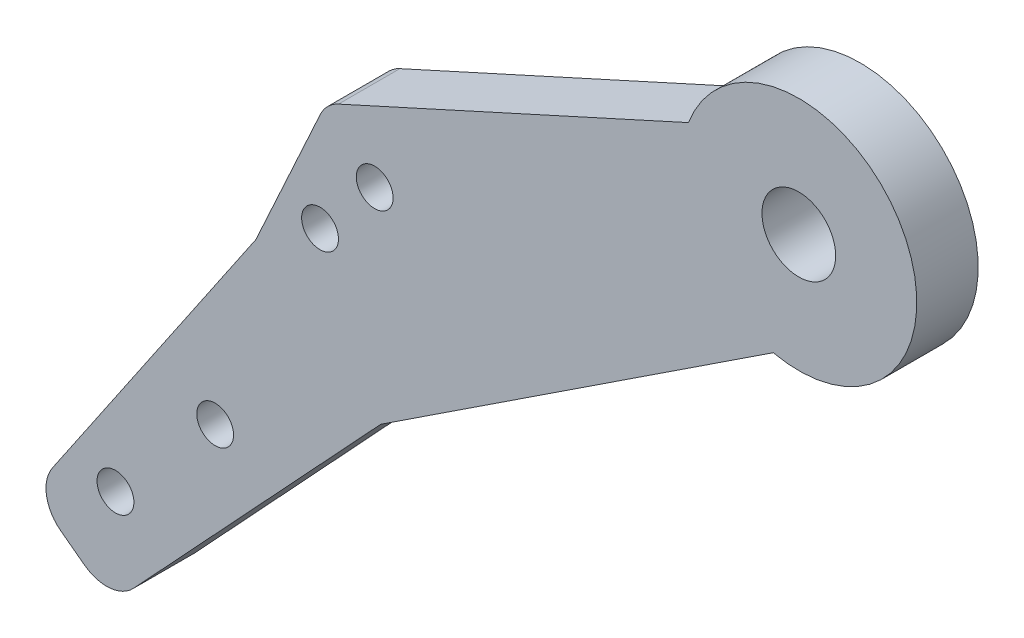
ISO-10303-21;
HEADER;
FILE_DESCRIPTION(('STEP AP214'),'2;1');
FILE_NAME('part.step','',(''),(''),'','','');
FILE_SCHEMA(('AUTOMOTIVE_DESIGN { 1 0 10303 214 1 1 1 1 }'));
ENDSEC;
DATA;
#1=APPLICATION_CONTEXT('core data for automotive mechanical design processes');
#2=APPLICATION_PROTOCOL_DEFINITION('international standard','automotive_design',2000,#1);
#3=PRODUCT_CONTEXT('',#1,'mechanical');
#4=PRODUCT('Part','Part','',(#3));
#5=PRODUCT_RELATED_PRODUCT_CATEGORY('part','',(#4));
#6=PRODUCT_DEFINITION_FORMATION('','',#4);
#7=PRODUCT_DEFINITION_CONTEXT('part definition',#1,'design');
#8=PRODUCT_DEFINITION('design','',#6,#7);
#9=PRODUCT_DEFINITION_SHAPE('','',#8);
#10=(LENGTH_UNIT() NAMED_UNIT(*) SI_UNIT(.MILLI.,.METRE.));
#11=(NAMED_UNIT(*) PLANE_ANGLE_UNIT() SI_UNIT($,.RADIAN.));
#12=(NAMED_UNIT(*) SI_UNIT($,.STERADIAN.) SOLID_ANGLE_UNIT());
#13=UNCERTAINTY_MEASURE_WITH_UNIT(LENGTH_MEASURE(1.E-05),#10,'distance_accuracy_value','');
#14=(GEOMETRIC_REPRESENTATION_CONTEXT(3) GLOBAL_UNCERTAINTY_ASSIGNED_CONTEXT((#13)) GLOBAL_UNIT_ASSIGNED_CONTEXT((#10,
#11,#12)) REPRESENTATION_CONTEXT('',''));
#15=CARTESIAN_POINT('',(0.,0.,0.));
#16=DIRECTION('',(0.,0.,1.));
#17=DIRECTION('',(1.,0.,0.));
#18=AXIS2_PLACEMENT_3D('',#15,#16,#17);
#19=CARTESIAN_POINT('',(-36.234007884933,-12.2764814733259,5.));
#20=DIRECTION('',(0.,0.,1.));
#21=DIRECTION('',(1.,0.,0.));
#22=AXIS2_PLACEMENT_3D('',#19,#20,#21);
#23=CYLINDRICAL_SURFACE('',#22,3.);
#24=DIRECTION('',(0.,0.,1.));
#25=VECTOR('',#24,1.);
#26=CARTESIAN_POINT('',(-37.4746403881604,-9.54502929693041,5.));
#27=LINE('',#26,#25);
#28=CARTESIAN_POINT('',(-37.4746403881604,-9.54502929693041,0.));
#29=VERTEX_POINT('',#28);
#30=CARTESIAN_POINT('',(-37.4746403881604,-9.54502929693041,5.));
#31=VERTEX_POINT('',#30);
#32=EDGE_CURVE('E241',#29,#31,#27,.T.);
#33=ORIENTED_EDGE('',*,*,#32,.F.);
#34=CARTESIAN_POINT('',(-36.234007884933,-12.2764814733259,0.));
#35=DIRECTION('',(0.,0.,1.));
#36=DIRECTION('',(1.,0.,0.));
#37=AXIS2_PLACEMENT_3D('',#34,#35,#36);
#38=CIRCLE('',#37,3.);
#39=CARTESIAN_POINT('',(-38.9614603684219,-11.0270804367048,0.));
#40=VERTEX_POINT('',#39);
#41=EDGE_CURVE('E47',#40,#29,#38,.F.);
#42=ORIENTED_EDGE('',*,*,#41,.F.);
#43=DIRECTION('',(0.,0.,1.));
#44=VECTOR('',#43,1.);
#45=CARTESIAN_POINT('',(-38.9614603684219,-11.0270804367048,5.));
#46=LINE('',#45,#44);
#47=CARTESIAN_POINT('',(-38.9614603684219,-11.0270804367048,5.));
#48=VERTEX_POINT('',#47);
#49=EDGE_CURVE('E245',#48,#40,#46,.F.);
#50=ORIENTED_EDGE('',*,*,#49,.F.);
#51=CARTESIAN_POINT('',(-36.234007884933,-12.2764814733259,5.));
#52=DIRECTION('',(0.,0.,1.));
#53=DIRECTION('',(1.,0.,0.));
#54=AXIS2_PLACEMENT_3D('',#51,#52,#53);
#55=CIRCLE('',#54,3.);
#56=EDGE_CURVE('E11',#31,#48,#55,.T.);
#57=ORIENTED_EDGE('',*,*,#56,.F.);
#58=EDGE_LOOP('',(#33,#42,#50,#57));
#59=FACE_BOUND('',#58,.T.);
#60=ADVANCED_FACE('F39',(#59),#23,.T.);
#61=CARTESIAN_POINT('',(-58.2845231728592,-48.5302631190641,5.));
#62=DIRECTION('',(0.,0.,1.));
#63=DIRECTION('',(1.,0.,0.));
#64=AXIS2_PLACEMENT_3D('',#61,#62,#63);
#65=CYLINDRICAL_SURFACE('',#64,3.);
#66=DIRECTION('',(0.,0.,1.));
#67=VECTOR('',#66,1.);
#68=CARTESIAN_POINT('',(-60.7660495364761,-46.8444318977746,5.));
#69=LINE('',#68,#67);
#70=CARTESIAN_POINT('',(-60.7660495364761,-46.8444318977746,0.));
#71=VERTEX_POINT('',#70);
#72=CARTESIAN_POINT('',(-60.7660495364761,-46.8444318977746,5.));
#73=VERTEX_POINT('',#72);
#74=EDGE_CURVE('E227',#71,#73,#69,.T.);
#75=ORIENTED_EDGE('',*,*,#74,.F.);
#76=CARTESIAN_POINT('',(-58.2845231728592,-48.5302631190641,0.));
#77=DIRECTION('',(0.,0.,1.));
#78=DIRECTION('',(1.,0.,0.));
#79=AXIS2_PLACEMENT_3D('',#76,#77,#78);
#80=CIRCLE('',#79,3.);
#81=CARTESIAN_POINT('',(-60.0852189994931,-50.9297410914454,0.));
#82=VERTEX_POINT('',#81);
#83=EDGE_CURVE('E235',#82,#71,#80,.F.);
#84=ORIENTED_EDGE('',*,*,#83,.F.);
#85=DIRECTION('',(0.,0.,1.));
#86=VECTOR('',#85,1.);
#87=CARTESIAN_POINT('',(-60.0852189994931,-50.9297410914454,5.));
#88=LINE('',#87,#86);
#89=CARTESIAN_POINT('',(-60.0852189994931,-50.9297410914454,5.));
#90=VERTEX_POINT('',#89);
#91=EDGE_CURVE('E231',#90,#82,#88,.F.);
#92=ORIENTED_EDGE('',*,*,#91,.F.);
#93=CARTESIAN_POINT('',(-58.2845231728592,-48.5302631190641,5.));
#94=DIRECTION('',(0.,0.,1.));
#95=DIRECTION('',(1.,0.,0.));
#96=AXIS2_PLACEMENT_3D('',#93,#94,#95);
#97=CIRCLE('',#96,3.);
#98=EDGE_CURVE('E238',#73,#90,#97,.T.);
#99=ORIENTED_EDGE('',*,*,#98,.F.);
#100=EDGE_LOOP('',(#75,#84,#92,#99));
#101=FACE_BOUND('',#100,.T.);
#102=ADVANCED_FACE('F268',(#101),#65,.T.);
#103=CARTESIAN_POINT('',(-56.3531813204129,-49.9796447152002,5.));
#104=DIRECTION('',(0.,0.,-1.));
#105=DIRECTION('',(-1.,0.,0.));
#106=AXIS2_PLACEMENT_3D('',#103,#104,#105);
#107=CYLINDRICAL_SURFACE('',#106,3.);
#108=DIRECTION('',(0.,0.,-1.));
#109=VECTOR('',#108,1.);
#110=CARTESIAN_POINT('',(-54.1569788579378,-52.0233410585492,5.));
#111=LINE('',#110,#109);
#112=CARTESIAN_POINT('',(-54.1569788579378,-52.0233410585492,5.));
#113=VERTEX_POINT('',#112);
#114=CARTESIAN_POINT('',(-54.1569788579378,-52.0233410585492,0.));
#115=VERTEX_POINT('',#114);
#116=EDGE_CURVE('E126',#113,#115,#111,.T.);
#117=ORIENTED_EDGE('',*,*,#116,.F.);
#118=CARTESIAN_POINT('',(-56.3531813204129,-49.9796447152002,5.));
#119=DIRECTION('',(0.,0.,1.));
#120=DIRECTION('',(1.,0.,0.));
#121=AXIS2_PLACEMENT_3D('',#118,#119,#120);
#122=CIRCLE('',#121,3.);
#123=CARTESIAN_POINT('',(-58.1538771470468,-52.3791226875815,5.));
#124=VERTEX_POINT('',#123);
#125=EDGE_CURVE('E222',#124,#113,#122,.T.);
#126=ORIENTED_EDGE('',*,*,#125,.F.);
#127=DIRECTION('',(0.,0.,-1.));
#128=VECTOR('',#127,1.);
#129=CARTESIAN_POINT('',(-58.1538771470468,-52.3791226875815,5.));
#130=LINE('',#129,#128);
#131=CARTESIAN_POINT('',(-58.1538771470468,-52.3791226875815,0.));
#132=VERTEX_POINT('',#131);
#133=EDGE_CURVE('E218',#132,#124,#130,.F.);
#134=ORIENTED_EDGE('',*,*,#133,.F.);
#135=CARTESIAN_POINT('',(-56.3531813204129,-49.9796447152002,0.));
#136=DIRECTION('',(0.,0.,1.));
#137=DIRECTION('',(1.,0.,0.));
#138=AXIS2_PLACEMENT_3D('',#135,#136,#137);
#139=CIRCLE('',#138,3.);
#140=EDGE_CURVE('E225',#115,#132,#139,.F.);
#141=ORIENTED_EDGE('',*,*,#140,.F.);
#142=EDGE_LOOP('',(#117,#126,#134,#141));
#143=FACE_BOUND('',#142,.T.);
#144=ADVANCED_FACE('F259',(#143),#107,.T.);
#145=CARTESIAN_POINT('',(3.67686539619426,-5.58898567347146,5.));
#146=DIRECTION('',(0.549606187771937,-0.835423867484523,0.));
#147=DIRECTION('',(0.835423867484523,0.549606187771937,0.));
#148=AXIS2_PLACEMENT_3D('',#145,#146,#147);
#149=PLANE('',#148);
#150=DIRECTION('',(-0.835423867484523,-0.549606187771937,0.));
#151=VECTOR('',#150,1.);
#152=CARTESIAN_POINT('',(3.67686539619426,-5.58898567347146,0.));
#153=LINE('',#152,#151);
#154=CARTESIAN_POINT('',(-2.08089171723586,-9.37688192637293,0.));
#155=VERTEX_POINT('',#154);
#156=CARTESIAN_POINT('',(-34.0324813155954,-30.3970993703439,0.));
#157=VERTEX_POINT('',#156);
#158=EDGE_CURVE('E121',#155,#157,#153,.T.);
#159=ORIENTED_EDGE('',*,*,#158,.F.);
#160=DIRECTION('',(0.,0.,-1.));
#161=VECTOR('',#160,1.);
#162=CARTESIAN_POINT('',(-2.08089171723586,-9.37688192637293,5.));
#163=LINE('',#162,#161);
#164=CARTESIAN_POINT('',(-2.08089171723586,-9.37688192637293,5.));
#165=VERTEX_POINT('',#164);
#166=EDGE_CURVE('E114',#165,#155,#163,.T.);
#167=ORIENTED_EDGE('',*,*,#166,.F.);
#168=DIRECTION('',(-0.835423867484523,-0.549606187771937,0.));
#169=VECTOR('',#168,1.);
#170=CARTESIAN_POINT('',(3.67686539619426,-5.58898567347146,5.));
#171=LINE('',#170,#169);
#172=CARTESIAN_POINT('',(-34.0324813155954,-30.3970993703439,5.));
#173=VERTEX_POINT('',#172);
#174=EDGE_CURVE('E118',#165,#173,#171,.T.);
#175=ORIENTED_EDGE('',*,*,#174,.T.);
#176=DIRECTION('',(0.,0.,-1.));
#177=VECTOR('',#176,1.);
#178=CARTESIAN_POINT('',(-34.0324813155954,-30.3970993703439,5.));
#179=LINE('',#178,#177);
#180=EDGE_CURVE('E166',#173,#157,#179,.T.);
#181=ORIENTED_EDGE('',*,*,#180,.T.);
#182=EDGE_LOOP('',(#159,#167,#175,#181));
#183=FACE_BOUND('',#182,.T.);
#184=ADVANCED_FACE('F116',(#183),#149,.T.);
#185=CARTESIAN_POINT('',(0.,0.,5.));
#186=DIRECTION('',(0.,0.,-1.));
#187=DIRECTION('',(-1.,0.,0.));
#188=AXIS2_PLACEMENT_3D('',#185,#186,#187);
#189=CYLINDRICAL_SURFACE('',#188,9.605);
#190=CARTESIAN_POINT('',(0.,0.,0.));
#191=DIRECTION('',(0.,0.,1.));
#192=DIRECTION('',(1.,0.,0.));
#193=AXIS2_PLACEMENT_3D('',#190,#191,#192);
#194=CIRCLE('',#193,9.605);
#195=CARTESIAN_POINT('',(-8.98496773711044,3.39505224747493,0.));
#196=VERTEX_POINT('',#195);
#197=EDGE_CURVE('E185',#155,#196,#194,.T.);
#198=ORIENTED_EDGE('',*,*,#197,.T.);
#199=DIRECTION('',(0.,0.,-1.));
#200=VECTOR('',#199,1.);
#201=CARTESIAN_POINT('',(-8.98496773711044,3.39505224747493,5.));
#202=LINE('',#201,#200);
#203=CARTESIAN_POINT('',(-8.98496773711044,3.39505224747493,5.));
#204=VERTEX_POINT('',#203);
#205=EDGE_CURVE('E127',#204,#196,#202,.T.);
#206=ORIENTED_EDGE('',*,*,#205,.F.);
#207=CARTESIAN_POINT('',(0.,0.,5.));
#208=DIRECTION('',(0.,0.,1.));
#209=DIRECTION('',(1.,0.,0.));
#210=AXIS2_PLACEMENT_3D('',#207,#208,#209);
#211=CIRCLE('',#210,9.605);
#212=EDGE_CURVE('E131',#165,#204,#211,.T.);
#213=ORIENTED_EDGE('',*,*,#212,.F.);
#214=ORIENTED_EDGE('',*,*,#166,.T.);
#215=EDGE_LOOP('',(#198,#206,#213,#214));
#216=FACE_BOUND('',#215,.T.);
#217=ADVANCED_FACE('F132',(#216),#189,.T.);
#218=CARTESIAN_POINT('',(-2.81492152041373,6.19750288124389,5.));
#219=DIRECTION('',(-0.413544167742466,0.910484058798501,0.));
#220=DIRECTION('',(-0.910484058798501,-0.413544167742466,0.));
#221=AXIS2_PLACEMENT_3D('',#218,#219,#220);
#222=PLANE('',#221);
#223=DIRECTION('',(0.910484058798501,0.413544167742466,0.));
#224=VECTOR('',#223,1.);
#225=CARTESIAN_POINT('',(-2.81492152041373,6.19750288124389,0.));
#226=LINE('',#225,#224);
#227=EDGE_CURVE('E188',#29,#196,#226,.T.);
#228=ORIENTED_EDGE('',*,*,#227,.F.);
#229=ORIENTED_EDGE('',*,*,#32,.T.);
#230=DIRECTION('',(0.910484058798501,0.413544167742466,0.));
#231=VECTOR('',#230,1.);
#232=CARTESIAN_POINT('',(-2.81492152041373,6.19750288124389,5.));
#233=LINE('',#232,#231);
#234=EDGE_CURVE('E135',#31,#204,#233,.T.);
#235=ORIENTED_EDGE('',*,*,#234,.T.);
#236=ORIENTED_EDGE('',*,*,#205,.T.);
#237=EDGE_LOOP('',(#228,#229,#235,#236));
#238=FACE_BOUND('',#237,.T.);
#239=ADVANCED_FACE('F253',(#238),#222,.T.);
#240=CARTESIAN_POINT('',(-28.0286006282676,12.8394400606389,5.));
#241=DIRECTION('',(-0.909150827829651,0.416467012207042,0.));
#242=DIRECTION('',(-0.416467012207042,-0.909150827829651,0.));
#243=AXIS2_PLACEMENT_3D('',#240,#241,#242);
#244=PLANE('',#243);
#245=DIRECTION('',(0.416467012207042,0.909150827829651,0.));
#246=VECTOR('',#245,1.);
#247=CARTESIAN_POINT('',(-28.0286006282676,12.8394400606389,5.));
#248=LINE('',#247,#246);
#249=CARTESIAN_POINT('',(-44.1951076829761,-22.4521744996888,5.));
#250=VERTEX_POINT('',#249);
#251=EDGE_CURVE('E153',#250,#48,#248,.T.);
#252=ORIENTED_EDGE('',*,*,#251,.T.);
#253=ORIENTED_EDGE('',*,*,#49,.T.);
#254=DIRECTION('',(0.416467012207042,0.909150827829651,0.));
#255=VECTOR('',#254,1.);
#256=CARTESIAN_POINT('',(-28.0286006282676,12.8394400606389,0.));
#257=LINE('',#256,#255);
#258=CARTESIAN_POINT('',(-44.1951076829761,-22.4521744996888,0.));
#259=VERTEX_POINT('',#258);
#260=EDGE_CURVE('E191',#259,#40,#257,.T.);
#261=ORIENTED_EDGE('',*,*,#260,.F.);
#262=DIRECTION('',(0.,0.,-1.));
#263=VECTOR('',#262,1.);
#264=CARTESIAN_POINT('',(-44.1951076829761,-22.4521744996888,5.));
#265=LINE('',#264,#263);
#266=EDGE_CURVE('E209',#250,#259,#265,.T.);
#267=ORIENTED_EDGE('',*,*,#266,.F.);
#268=EDGE_LOOP('',(#252,#253,#261,#267));
#269=FACE_BOUND('',#268,.T.);
#270=ADVANCED_FACE('F275',(#269),#244,.T.);
#271=CARTESIAN_POINT('',(-19.8027866518628,13.4530732760731,5.));
#272=DIRECTION('',(-0.827175454538959,0.561943740429828,0.));
#273=DIRECTION('',(-0.561943740429828,-0.827175454538959,0.));
#274=AXIS2_PLACEMENT_3D('',#271,#272,#273);
#275=PLANE('',#274);
#276=DIRECTION('',(0.561943740429828,0.827175454538959,0.));
#277=VECTOR('',#276,1.);
#278=CARTESIAN_POINT('',(-19.8027866518628,13.4530732760731,0.));
#279=LINE('',#278,#277);
#280=EDGE_CURVE('E195',#71,#259,#279,.T.);
#281=ORIENTED_EDGE('',*,*,#280,.F.);
#282=ORIENTED_EDGE('',*,*,#74,.T.);
#283=DIRECTION('',(0.561943740429828,0.827175454538959,0.));
#284=VECTOR('',#283,1.);
#285=CARTESIAN_POINT('',(-19.8027866518628,13.4530732760731,5.));
#286=LINE('',#285,#284);
#287=EDGE_CURVE('E157',#73,#250,#286,.T.);
#288=ORIENTED_EDGE('',*,*,#287,.T.);
#289=ORIENTED_EDGE('',*,*,#266,.T.);
#290=EDGE_LOOP('',(#281,#282,#288,#289));
#291=FACE_BOUND('',#290,.T.);
#292=ADVANCED_FACE('F272',(#291),#275,.T.);
#293=CARTESIAN_POINT('',(-46.0978121579961,-61.4266347553275,5.));
#294=DIRECTION('',(-0.600231942211304,-0.799825990793777,0.));
#295=DIRECTION('',(0.799825990793777,-0.600231942211304,0.));
#296=AXIS2_PLACEMENT_3D('',#293,#294,#295);
#297=PLANE('',#296);
#298=DIRECTION('',(-0.799825990793776,0.600231942211304,0.));
#299=VECTOR('',#298,1.);
#300=CARTESIAN_POINT('',(-46.0978121579961,-61.4266347553275,5.));
#301=LINE('',#300,#299);
#302=EDGE_CURVE('E160',#124,#90,#301,.T.);
#303=ORIENTED_EDGE('',*,*,#302,.T.);
#304=ORIENTED_EDGE('',*,*,#91,.T.);
#305=DIRECTION('',(-0.799825990793776,0.600231942211304,0.));
#306=VECTOR('',#305,1.);
#307=CARTESIAN_POINT('',(-46.0978121579961,-61.4266347553275,0.));
#308=LINE('',#307,#306);
#309=EDGE_CURVE('E198',#132,#82,#308,.T.);
#310=ORIENTED_EDGE('',*,*,#309,.F.);
#311=ORIENTED_EDGE('',*,*,#133,.T.);
#312=EDGE_LOOP('',(#303,#304,#310,#311));
#313=FACE_BOUND('',#312,.T.);
#314=ADVANCED_FACE('F264',(#313),#297,.T.);
#315=CARTESIAN_POINT('',(-55.630247579627,-45.9439625608715,5.));
#316=DIRECTION('',(0.,0.,-1.));
#317=DIRECTION('',(-1.,0.,0.));
#318=AXIS2_PLACEMENT_3D('',#315,#316,#317);
#319=CYLINDRICAL_SURFACE('',#318,1.50000000000002);
#320=CARTESIAN_POINT('',(-55.630247579627,-45.9439625608715,5.));
#321=DIRECTION('',(0.,0.,1.));
#322=DIRECTION('',(1.,0.,0.));
#323=AXIS2_PLACEMENT_3D('',#320,#321,#322);
#324=CIRCLE('',#323,1.50000000000002);
#325=CARTESIAN_POINT('',(-54.130247579627,-45.9439625608715,5.));
#326=VERTEX_POINT('',#325);
#327=EDGE_CURVE('E141',#326,#326,#324,.T.);
#328=ORIENTED_EDGE('',*,*,#327,.T.);
#329=EDGE_LOOP('',(#328));
#330=FACE_BOUND('',#329,.T.);
#331=CARTESIAN_POINT('',(-55.630247579627,-45.9439625608715,0.));
#332=DIRECTION('',(0.,0.,1.));
#333=DIRECTION('',(1.,0.,0.));
#334=AXIS2_PLACEMENT_3D('',#331,#332,#333);
#335=CIRCLE('',#334,1.50000000000002);
#336=CARTESIAN_POINT('',(-54.130247579627,-45.9439625608715,0.));
#337=VERTEX_POINT('',#336);
#338=EDGE_CURVE('E179',#337,#337,#335,.T.);
#339=ORIENTED_EDGE('',*,*,#338,.F.);
#340=EDGE_LOOP('',(#339));
#341=FACE_BOUND('',#340,.T.);
#342=ADVANCED_FACE('F304',(#330,#341),#319,.F.);
#343=CARTESIAN_POINT('',(-47.5127067385957,-37.147272561977,5.));
#344=DIRECTION('',(0.,0.,-1.));
#345=DIRECTION('',(-1.,0.,0.));
#346=AXIS2_PLACEMENT_3D('',#343,#344,#345);
#347=CYLINDRICAL_SURFACE('',#346,1.50000000000001);
#348=CARTESIAN_POINT('',(-47.5127067385957,-37.147272561977,5.));
#349=DIRECTION('',(0.,0.,1.));
#350=DIRECTION('',(1.,0.,0.));
#351=AXIS2_PLACEMENT_3D('',#348,#349,#350);
#352=CIRCLE('',#351,1.50000000000001);
#353=CARTESIAN_POINT('',(-46.0127067385956,-37.147272561977,5.));
#354=VERTEX_POINT('',#353);
#355=EDGE_CURVE('E147',#354,#354,#352,.T.);
#356=ORIENTED_EDGE('',*,*,#355,.T.);
#357=EDGE_LOOP('',(#356));
#358=FACE_BOUND('',#357,.T.);
#359=CARTESIAN_POINT('',(-47.5127067385957,-37.147272561977,0.));
#360=DIRECTION('',(0.,0.,1.));
#361=DIRECTION('',(1.,0.,0.));
#362=AXIS2_PLACEMENT_3D('',#359,#360,#361);
#363=CIRCLE('',#362,1.50000000000001);
#364=CARTESIAN_POINT('',(-46.0127067385956,-37.147272561977,0.));
#365=VERTEX_POINT('',#364);
#366=EDGE_CURVE('E175',#365,#365,#363,.T.);
#367=ORIENTED_EDGE('',*,*,#366,.F.);
#368=EDGE_LOOP('',(#367));
#369=FACE_BOUND('',#368,.T.);
#370=ADVANCED_FACE('F300',(#358,#369),#347,.F.);
#371=CARTESIAN_POINT('',(-34.5272921400029,-13.942898159833,5.));
#372=DIRECTION('',(0.,0.,-1.));
#373=DIRECTION('',(-1.,0.,0.));
#374=AXIS2_PLACEMENT_3D('',#371,#372,#373);
#375=CYLINDRICAL_SURFACE('',#374,1.49999999999997);
#376=CARTESIAN_POINT('',(-34.5272921400029,-13.942898159833,5.));
#377=DIRECTION('',(0.,0.,1.));
#378=DIRECTION('',(1.,0.,0.));
#379=AXIS2_PLACEMENT_3D('',#376,#377,#378);
#380=CIRCLE('',#379,1.49999999999997);
#381=CARTESIAN_POINT('',(-33.0272921400029,-13.942898159833,5.));
#382=VERTEX_POINT('',#381);
#383=EDGE_CURVE('E456',#382,#382,#380,.T.);
#384=ORIENTED_EDGE('',*,*,#383,.T.);
#385=EDGE_LOOP('',(#384));
#386=FACE_BOUND('',#385,.T.);
#387=CARTESIAN_POINT('',(-34.5272921400029,-13.942898159833,0.));
#388=DIRECTION('',(0.,0.,1.));
#389=DIRECTION('',(1.,0.,0.));
#390=AXIS2_PLACEMENT_3D('',#387,#388,#389);
#391=CIRCLE('',#390,1.49999999999997);
#392=CARTESIAN_POINT('',(-33.0272921400029,-13.942898159833,0.));
#393=VERTEX_POINT('',#392);
#394=EDGE_CURVE('E171',#393,#393,#391,.T.);
#395=ORIENTED_EDGE('',*,*,#394,.F.);
#396=EDGE_LOOP('',(#395));
#397=FACE_BOUND('',#396,.T.);
#398=ADVANCED_FACE('F296',(#386,#397),#375,.F.);
#399=CARTESIAN_POINT('',(-38.9755439125627,-19.0619180568266,5.));
#400=DIRECTION('',(0.,0.,-1.));
#401=DIRECTION('',(-1.,0.,0.));
#402=AXIS2_PLACEMENT_3D('',#399,#400,#401);
#403=CYLINDRICAL_SURFACE('',#402,1.49999999999993);
#404=CARTESIAN_POINT('',(-38.9755439125627,-19.0619180568266,5.));
#405=DIRECTION('',(0.,0.,1.));
#406=DIRECTION('',(1.,0.,0.));
#407=AXIS2_PLACEMENT_3D('',#404,#405,#406);
#408=CIRCLE('',#407,1.49999999999993);
#409=CARTESIAN_POINT('',(-37.4755439125628,-19.0619180568266,5.));
#410=VERTEX_POINT('',#409);
#411=EDGE_CURVE('E206',#410,#410,#408,.T.);
#412=ORIENTED_EDGE('',*,*,#411,.T.);
#413=EDGE_LOOP('',(#412));
#414=FACE_BOUND('',#413,.T.);
#415=CARTESIAN_POINT('',(-38.9755439125627,-19.0619180568266,0.));
#416=DIRECTION('',(0.,0.,1.));
#417=DIRECTION('',(1.,0.,0.));
#418=AXIS2_PLACEMENT_3D('',#415,#416,#417);
#419=CIRCLE('',#418,1.49999999999993);
#420=CARTESIAN_POINT('',(-37.4755439125628,-19.0619180568266,0.));
#421=VERTEX_POINT('',#420);
#422=EDGE_CURVE('E167',#421,#421,#419,.T.);
#423=ORIENTED_EDGE('',*,*,#422,.F.);
#424=EDGE_LOOP('',(#423));
#425=FACE_BOUND('',#424,.T.);
#426=ADVANCED_FACE('F293',(#414,#425),#403,.F.);
#427=CARTESIAN_POINT('',(-3.07950983123572,2.8656661163702,5.));
#428=DIRECTION('',(0.732067487491713,-0.681232114449672,0.));
#429=DIRECTION('',(0.681232114449672,0.732067487491713,0.));
#430=AXIS2_PLACEMENT_3D('',#427,#428,#429);
#431=PLANE('',#430);
#432=DIRECTION('',(-0.681232114449672,-0.732067487491713,0.));
#433=VECTOR('',#432,1.);
#434=CARTESIAN_POINT('',(-3.07950983123572,2.8656661163702,5.));
#435=LINE('',#434,#433);
#436=EDGE_CURVE('E139',#173,#113,#435,.T.);
#437=ORIENTED_EDGE('',*,*,#436,.T.);
#438=ORIENTED_EDGE('',*,*,#116,.T.);
#439=DIRECTION('',(-0.681232114449672,-0.732067487491713,0.));
#440=VECTOR('',#439,1.);
#441=CARTESIAN_POINT('',(-3.07950983123572,2.8656661163702,0.));
#442=LINE('',#441,#440);
#443=EDGE_CURVE('E202',#157,#115,#442,.T.);
#444=ORIENTED_EDGE('',*,*,#443,.F.);
#445=ORIENTED_EDGE('',*,*,#180,.F.);
#446=EDGE_LOOP('',(#437,#438,#444,#445));
#447=FACE_BOUND('',#446,.T.);
#448=ADVANCED_FACE('F256',(#447),#431,.T.);
#449=CARTESIAN_POINT('',(0.,0.,5.));
#450=DIRECTION('',(0.,0.,1.));
#451=DIRECTION('',(1.,0.,0.));
#452=AXIS2_PLACEMENT_3D('',#449,#450,#451);
#453=PLANE('',#452);
#454=CARTESIAN_POINT('',(0.,0.,5.));
#455=DIRECTION('',(0.,0.,1.));
#456=DIRECTION('',(1.,0.,0.));
#457=AXIS2_PLACEMENT_3D('',#454,#455,#456);
#458=CIRCLE('',#457,3.);
#459=CARTESIAN_POINT('',(3.,0.,5.));
#460=VERTEX_POINT('',#459);
#461=EDGE_CURVE('E447',#460,#460,#458,.T.);
#462=ORIENTED_EDGE('',*,*,#461,.F.);
#463=EDGE_LOOP('',(#462));
#464=FACE_BOUND('',#463,.T.);
#465=ORIENTED_EDGE('',*,*,#411,.F.);
#466=EDGE_LOOP('',(#465));
#467=FACE_BOUND('',#466,.T.);
#468=ORIENTED_EDGE('',*,*,#383,.F.);
#469=EDGE_LOOP('',(#468));
#470=FACE_BOUND('',#469,.T.);
#471=ORIENTED_EDGE('',*,*,#355,.F.);
#472=EDGE_LOOP('',(#471));
#473=FACE_BOUND('',#472,.T.);
#474=ORIENTED_EDGE('',*,*,#327,.F.);
#475=EDGE_LOOP('',(#474));
#476=FACE_BOUND('',#475,.T.);
#477=ORIENTED_EDGE('',*,*,#234,.F.);
#478=ORIENTED_EDGE('',*,*,#56,.T.);
#479=ORIENTED_EDGE('',*,*,#251,.F.);
#480=ORIENTED_EDGE('',*,*,#287,.F.);
#481=ORIENTED_EDGE('',*,*,#98,.T.);
#482=ORIENTED_EDGE('',*,*,#302,.F.);
#483=ORIENTED_EDGE('',*,*,#125,.T.);
#484=ORIENTED_EDGE('',*,*,#436,.F.);
#485=ORIENTED_EDGE('',*,*,#174,.F.);
#486=ORIENTED_EDGE('',*,*,#212,.T.);
#487=EDGE_LOOP('',(#477,#478,#479,#480,#481,#482,#483,#484,#485,#486));
#488=FACE_BOUND('',#487,.T.);
#489=ADVANCED_FACE('F137',(#464,#467,#470,#473,#476,#488),#453,.T.);
#490=CARTESIAN_POINT('',(0.,0.,0.));
#491=DIRECTION('',(0.,0.,1.));
#492=DIRECTION('',(1.,0.,0.));
#493=AXIS2_PLACEMENT_3D('',#490,#491,#492);
#494=PLANE('',#493);
#495=CARTESIAN_POINT('',(0.,0.,0.));
#496=DIRECTION('',(0.,0.,1.));
#497=DIRECTION('',(1.,0.,0.));
#498=AXIS2_PLACEMENT_3D('',#495,#496,#497);
#499=CIRCLE('',#498,3.);
#500=CARTESIAN_POINT('',(3.,0.,0.));
#501=VERTEX_POINT('',#500);
#502=EDGE_CURVE('E172',#501,#501,#499,.T.);
#503=ORIENTED_EDGE('',*,*,#502,.T.);
#504=EDGE_LOOP('',(#503));
#505=FACE_BOUND('',#504,.T.);
#506=ORIENTED_EDGE('',*,*,#422,.T.);
#507=EDGE_LOOP('',(#506));
#508=FACE_BOUND('',#507,.T.);
#509=ORIENTED_EDGE('',*,*,#394,.T.);
#510=EDGE_LOOP('',(#509));
#511=FACE_BOUND('',#510,.T.);
#512=ORIENTED_EDGE('',*,*,#366,.T.);
#513=EDGE_LOOP('',(#512));
#514=FACE_BOUND('',#513,.T.);
#515=ORIENTED_EDGE('',*,*,#338,.T.);
#516=EDGE_LOOP('',(#515));
#517=FACE_BOUND('',#516,.T.);
#518=ORIENTED_EDGE('',*,*,#260,.T.);
#519=ORIENTED_EDGE('',*,*,#41,.T.);
#520=ORIENTED_EDGE('',*,*,#227,.T.);
#521=ORIENTED_EDGE('',*,*,#197,.F.);
#522=ORIENTED_EDGE('',*,*,#158,.T.);
#523=ORIENTED_EDGE('',*,*,#443,.T.);
#524=ORIENTED_EDGE('',*,*,#140,.T.);
#525=ORIENTED_EDGE('',*,*,#309,.T.);
#526=ORIENTED_EDGE('',*,*,#83,.T.);
#527=ORIENTED_EDGE('',*,*,#280,.T.);
#528=EDGE_LOOP('',(#518,#519,#520,#521,#522,#523,#524,#525,#526,#527));
#529=FACE_BOUND('',#528,.T.);
#530=ADVANCED_FACE('F249',(#505,#508,#511,#514,#517,#529),#494,.F.);
#531=CARTESIAN_POINT('',(0.,0.,0.));
#532=DIRECTION('',(0.,0.,1.));
#533=DIRECTION('',(1.,0.,0.));
#534=AXIS2_PLACEMENT_3D('',#531,#532,#533);
#535=CYLINDRICAL_SURFACE('',#534,3.);
#536=ORIENTED_EDGE('',*,*,#502,.F.);
#537=EDGE_LOOP('',(#536));
#538=FACE_BOUND('',#537,.T.);
#539=ORIENTED_EDGE('',*,*,#461,.T.);
#540=EDGE_LOOP('',(#539));
#541=FACE_BOUND('',#540,.T.);
#542=ADVANCED_FACE('F379',(#538,#541),#535,.F.);
#543=CLOSED_SHELL('',(#60,#102,#144,#184,#217,#239,#270,#292,#314,#342,#370,#398,#426,#448,#489,
#530,#542));
#544=MANIFOLD_SOLID_BREP('B2',#543);
#545=ADVANCED_BREP_SHAPE_REPRESENTATION('',(#18,#544),#14);
#546=SHAPE_DEFINITION_REPRESENTATION(#9,#545);
ENDSEC;
END-ISO-10303-21;
